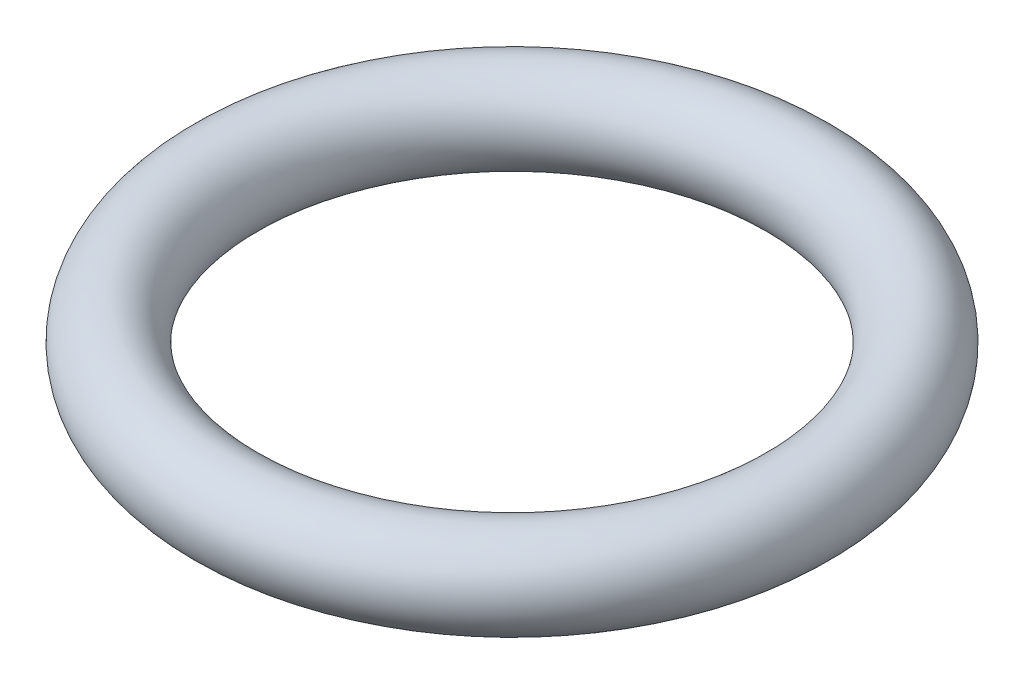
ISO-10303-21;
HEADER;
FILE_DESCRIPTION(('STEP AP214'),'2;1');
FILE_NAME('part.step','',(''),(''),'','','');
FILE_SCHEMA(('AUTOMOTIVE_DESIGN { 1 0 10303 214 1 1 1 1 }'));
ENDSEC;
DATA;
#1=APPLICATION_CONTEXT('core data for automotive mechanical design processes');
#2=APPLICATION_PROTOCOL_DEFINITION('international standard','automotive_design',2000,#1);
#3=PRODUCT_CONTEXT('',#1,'mechanical');
#4=PRODUCT('Part','Part','',(#3));
#5=PRODUCT_RELATED_PRODUCT_CATEGORY('part','',(#4));
#6=PRODUCT_DEFINITION_FORMATION('','',#4);
#7=PRODUCT_DEFINITION_CONTEXT('part definition',#1,'design');
#8=PRODUCT_DEFINITION('design','',#6,#7);
#9=PRODUCT_DEFINITION_SHAPE('','',#8);
#10=(LENGTH_UNIT() NAMED_UNIT(*) SI_UNIT(.MILLI.,.METRE.));
#11=(NAMED_UNIT(*) PLANE_ANGLE_UNIT() SI_UNIT($,.RADIAN.));
#12=(NAMED_UNIT(*) SI_UNIT($,.STERADIAN.) SOLID_ANGLE_UNIT());
#13=UNCERTAINTY_MEASURE_WITH_UNIT(LENGTH_MEASURE(1.E-05),#10,'distance_accuracy_value','');
#14=(GEOMETRIC_REPRESENTATION_CONTEXT(3) GLOBAL_UNCERTAINTY_ASSIGNED_CONTEXT((#13)) GLOBAL_UNIT_ASSIGNED_CONTEXT((#10,
#11,#12)) REPRESENTATION_CONTEXT('',''));
#15=CARTESIAN_POINT('',(0.,0.,0.));
#16=DIRECTION('',(0.,0.,1.));
#17=DIRECTION('',(1.,0.,0.));
#18=AXIS2_PLACEMENT_3D('',#15,#16,#17);
#19=CARTESIAN_POINT('',(0.,0.,0.));
#20=DIRECTION('',(0.,-1.,0.));
#21=DIRECTION('',(0.,0.,-0.999999999999998));
#22=AXIS2_PLACEMENT_3D('',#19,#20,#21);
#23=TOROIDAL_SURFACE('',#22,5.5,0.85);
#24=CARTESIAN_POINT('',(0.,0.,-6.34999999999999));
#25=VERTEX_POINT('',#24);
#26=VERTEX_LOOP('',#25);
#27=FACE_BOUND('',#26,.T.);
#28=ADVANCED_FACE('F33',(#27),#23,.T.);
#29=CLOSED_SHELL('',(#28));
#30=MANIFOLD_SOLID_BREP('B2',#29);
#31=ADVANCED_BREP_SHAPE_REPRESENTATION('',(#18,#30),#14);
#32=SHAPE_DEFINITION_REPRESENTATION(#9,#31);
ENDSEC;
END-ISO-10303-21;
